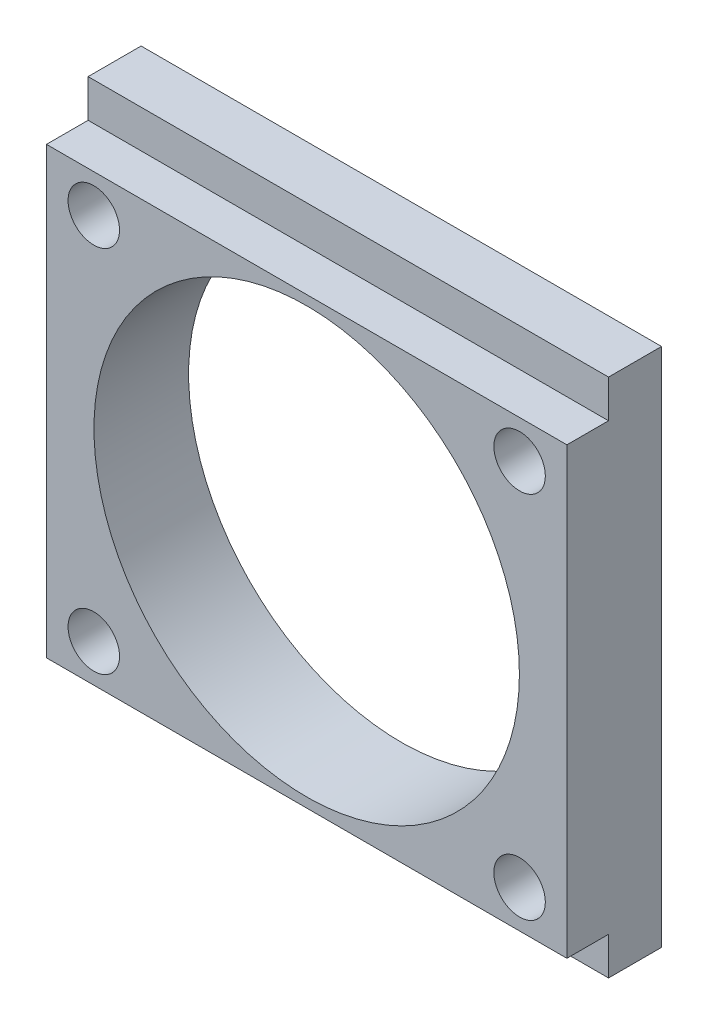
ISO-10303-21;
HEADER;
FILE_DESCRIPTION(('STEP AP214'),'2;1');
FILE_NAME('part.step','',(''),(''),'','','');
FILE_SCHEMA(('AUTOMOTIVE_DESIGN { 1 0 10303 214 1 1 1 1 }'));
ENDSEC;
DATA;
#1=APPLICATION_CONTEXT('core data for automotive mechanical design processes');
#2=APPLICATION_PROTOCOL_DEFINITION('international standard','automotive_design',2000,#1);
#3=PRODUCT_CONTEXT('',#1,'mechanical');
#4=PRODUCT('Part','Part','',(#3));
#5=PRODUCT_RELATED_PRODUCT_CATEGORY('part','',(#4));
#6=PRODUCT_DEFINITION_FORMATION('','',#4);
#7=PRODUCT_DEFINITION_CONTEXT('part definition',#1,'design');
#8=PRODUCT_DEFINITION('design','',#6,#7);
#9=PRODUCT_DEFINITION_SHAPE('','',#8);
#10=(LENGTH_UNIT() NAMED_UNIT(*) SI_UNIT(.MILLI.,.METRE.));
#11=(NAMED_UNIT(*) PLANE_ANGLE_UNIT() SI_UNIT($,.RADIAN.));
#12=(NAMED_UNIT(*) SI_UNIT($,.STERADIAN.) SOLID_ANGLE_UNIT());
#13=UNCERTAINTY_MEASURE_WITH_UNIT(LENGTH_MEASURE(1.E-05),#10,'distance_accuracy_value','');
#14=(GEOMETRIC_REPRESENTATION_CONTEXT(3) GLOBAL_UNCERTAINTY_ASSIGNED_CONTEXT((#13)) GLOBAL_UNIT_ASSIGNED_CONTEXT((#10,
#11,#12)) REPRESENTATION_CONTEXT('',''));
#15=CARTESIAN_POINT('',(0.,0.,0.));
#16=DIRECTION('',(0.,0.,1.));
#17=DIRECTION('',(1.,0.,0.));
#18=AXIS2_PLACEMENT_3D('',#15,#16,#17);
#19=CARTESIAN_POINT('',(17.4625,33.655,3.556));
#20=DIRECTION('',(0.,0.,1.));
#21=DIRECTION('',(1.,0.,0.));
#22=AXIS2_PLACEMENT_3D('',#19,#20,#21);
#23=PLANE('',#22);
#24=DIRECTION('',(0.,1.,0.));
#25=VECTOR('',#24,1.);
#26=CARTESIAN_POINT('',(0.,0.,3.556));
#27=LINE('',#26,#25);
#28=CARTESIAN_POINT('',(0.,32.385,3.556));
#29=VERTEX_POINT('',#28);
#30=CARTESIAN_POINT('',(0.,34.925,3.556));
#31=VERTEX_POINT('',#30);
#32=EDGE_CURVE('E91',#29,#31,#27,.T.);
#33=ORIENTED_EDGE('',*,*,#32,.F.);
#34=DIRECTION('',(1.,0.,0.));
#35=VECTOR('',#34,1.);
#36=CARTESIAN_POINT('',(0.,32.385,3.556));
#37=LINE('',#36,#35);
#38=CARTESIAN_POINT('',(34.925,32.385,3.556));
#39=VERTEX_POINT('',#38);
#40=EDGE_CURVE('E86',#29,#39,#37,.T.);
#41=ORIENTED_EDGE('',*,*,#40,.T.);
#42=DIRECTION('',(0.,1.,0.));
#43=VECTOR('',#42,1.);
#44=CARTESIAN_POINT('',(34.925,34.925,3.556));
#45=LINE('',#44,#43);
#46=CARTESIAN_POINT('',(34.925,34.925,3.556));
#47=VERTEX_POINT('',#46);
#48=EDGE_CURVE('E89',#47,#39,#45,.F.);
#49=ORIENTED_EDGE('',*,*,#48,.F.);
#50=DIRECTION('',(1.,0.,0.));
#51=VECTOR('',#50,1.);
#52=CARTESIAN_POINT('',(0.,34.925,3.556));
#53=LINE('',#52,#51);
#54=EDGE_CURVE('E104',#31,#47,#53,.T.);
#55=ORIENTED_EDGE('',*,*,#54,.F.);
#56=EDGE_LOOP('',(#33,#41,#49,#55));
#57=FACE_BOUND('',#56,.T.);
#58=ADVANCED_FACE('F17',(#57),#23,.T.);
#59=CARTESIAN_POINT('',(17.4625,1.27,3.556));
#60=DIRECTION('',(0.,0.,1.));
#61=DIRECTION('',(1.,0.,0.));
#62=AXIS2_PLACEMENT_3D('',#59,#60,#61);
#63=PLANE('',#62);
#64=DIRECTION('',(1.,0.,0.));
#65=VECTOR('',#64,1.);
#66=CARTESIAN_POINT('',(34.925,2.54,3.556));
#67=LINE('',#66,#65);
#68=CARTESIAN_POINT('',(34.925,2.54,3.556));
#69=VERTEX_POINT('',#68);
#70=CARTESIAN_POINT('',(0.,2.54,3.556));
#71=VERTEX_POINT('',#70);
#72=EDGE_CURVE('E80',#69,#71,#67,.F.);
#73=ORIENTED_EDGE('',*,*,#72,.T.);
#74=DIRECTION('',(0.,1.,0.));
#75=VECTOR('',#74,1.);
#76=CARTESIAN_POINT('',(0.,0.,3.556));
#77=LINE('',#76,#75);
#78=CARTESIAN_POINT('',(0.,0.,3.556));
#79=VERTEX_POINT('',#78);
#80=EDGE_CURVE('E164',#79,#71,#77,.T.);
#81=ORIENTED_EDGE('',*,*,#80,.F.);
#82=DIRECTION('',(1.,0.,0.));
#83=VECTOR('',#82,1.);
#84=CARTESIAN_POINT('',(34.925,0.,3.556));
#85=LINE('',#84,#83);
#86=CARTESIAN_POINT('',(34.925,0.,3.556));
#87=VERTEX_POINT('',#86);
#88=EDGE_CURVE('E160',#87,#79,#85,.F.);
#89=ORIENTED_EDGE('',*,*,#88,.F.);
#90=DIRECTION('',(0.,1.,0.));
#91=VECTOR('',#90,1.);
#92=CARTESIAN_POINT('',(34.925,34.925,3.556));
#93=LINE('',#92,#91);
#94=EDGE_CURVE('E105',#69,#87,#93,.F.);
#95=ORIENTED_EDGE('',*,*,#94,.F.);
#96=EDGE_LOOP('',(#73,#81,#89,#95));
#97=FACE_BOUND('',#96,.T.);
#98=ADVANCED_FACE('F178',(#97),#63,.T.);
#99=CARTESIAN_POINT('',(0.,32.385,6.35));
#100=DIRECTION('',(0.,-1.,0.));
#101=DIRECTION('',(0.,0.,-1.));
#102=AXIS2_PLACEMENT_3D('',#99,#100,#101);
#103=PLANE('',#102);
#104=DIRECTION('',(0.,0.,1.));
#105=VECTOR('',#104,1.);
#106=CARTESIAN_POINT('',(0.,32.385,0.));
#107=LINE('',#106,#105);
#108=CARTESIAN_POINT('',(0.,32.385,6.35));
#109=VERTEX_POINT('',#108);
#110=EDGE_CURVE('E169',#109,#29,#107,.F.);
#111=ORIENTED_EDGE('',*,*,#110,.F.);
#112=DIRECTION('',(1.,0.,0.));
#113=VECTOR('',#112,1.);
#114=CARTESIAN_POINT('',(17.4625,32.385,6.35));
#115=LINE('',#114,#113);
#116=CARTESIAN_POINT('',(34.925,32.385,6.35));
#117=VERTEX_POINT('',#116);
#118=EDGE_CURVE('E109',#117,#109,#115,.F.);
#119=ORIENTED_EDGE('',*,*,#118,.F.);
#120=DIRECTION('',(0.,0.,-1.));
#121=VECTOR('',#120,1.);
#122=CARTESIAN_POINT('',(34.925,32.385,0.));
#123=LINE('',#122,#121);
#124=EDGE_CURVE('E100',#39,#117,#123,.F.);
#125=ORIENTED_EDGE('',*,*,#124,.F.);
#126=ORIENTED_EDGE('',*,*,#40,.F.);
#127=EDGE_LOOP('',(#111,#119,#125,#126));
#128=FACE_BOUND('',#127,.T.);
#129=ADVANCED_FACE('F108',(#128),#103,.F.);
#130=CARTESIAN_POINT('',(34.925,2.54,6.35));
#131=DIRECTION('',(0.,1.,0.));
#132=DIRECTION('',(0.,0.,1.));
#133=AXIS2_PLACEMENT_3D('',#130,#131,#132);
#134=PLANE('',#133);
#135=DIRECTION('',(0.,0.,-1.));
#136=VECTOR('',#135,1.);
#137=CARTESIAN_POINT('',(34.925,2.54,0.));
#138=LINE('',#137,#136);
#139=CARTESIAN_POINT('',(34.925,2.54,6.35));
#140=VERTEX_POINT('',#139);
#141=EDGE_CURVE('E110',#140,#69,#138,.T.);
#142=ORIENTED_EDGE('',*,*,#141,.F.);
#143=DIRECTION('',(1.,0.,0.));
#144=VECTOR('',#143,1.);
#145=CARTESIAN_POINT('',(17.4625,2.54,6.35));
#146=LINE('',#145,#144);
#147=CARTESIAN_POINT('',(0.,2.54,6.35));
#148=VERTEX_POINT('',#147);
#149=EDGE_CURVE('E145',#148,#140,#146,.T.);
#150=ORIENTED_EDGE('',*,*,#149,.F.);
#151=DIRECTION('',(0.,0.,1.));
#152=VECTOR('',#151,1.);
#153=CARTESIAN_POINT('',(0.,2.54,0.));
#154=LINE('',#153,#152);
#155=EDGE_CURVE('E162',#71,#148,#154,.T.);
#156=ORIENTED_EDGE('',*,*,#155,.F.);
#157=ORIENTED_EDGE('',*,*,#72,.F.);
#158=EDGE_LOOP('',(#142,#150,#156,#157));
#159=FACE_BOUND('',#158,.T.);
#160=ADVANCED_FACE('F235',(#159),#134,.F.);
#161=CARTESIAN_POINT('',(34.925,34.925,0.));
#162=DIRECTION('',(1.,0.,0.));
#163=DIRECTION('',(0.,0.,-1.));
#164=AXIS2_PLACEMENT_3D('',#161,#162,#163);
#165=PLANE('',#164);
#166=DIRECTION('',(0.,0.,1.));
#167=VECTOR('',#166,1.);
#168=CARTESIAN_POINT('',(34.925,34.925,0.));
#169=LINE('',#168,#167);
#170=CARTESIAN_POINT('',(34.925,34.925,0.));
#171=VERTEX_POINT('',#170);
#172=EDGE_CURVE('E103',#47,#171,#169,.F.);
#173=ORIENTED_EDGE('',*,*,#172,.F.);
#174=ORIENTED_EDGE('',*,*,#48,.T.);
#175=ORIENTED_EDGE('',*,*,#124,.T.);
#176=DIRECTION('',(0.,1.,0.));
#177=VECTOR('',#176,1.);
#178=CARTESIAN_POINT('',(34.925,17.4625,6.35));
#179=LINE('',#178,#177);
#180=EDGE_CURVE('E142',#140,#117,#179,.T.);
#181=ORIENTED_EDGE('',*,*,#180,.F.);
#182=ORIENTED_EDGE('',*,*,#141,.T.);
#183=ORIENTED_EDGE('',*,*,#94,.T.);
#184=DIRECTION('',(0.,0.,-1.));
#185=VECTOR('',#184,1.);
#186=CARTESIAN_POINT('',(34.925,0.,0.));
#187=LINE('',#186,#185);
#188=CARTESIAN_POINT('',(34.925,0.,0.));
#189=VERTEX_POINT('',#188);
#190=EDGE_CURVE('E156',#189,#87,#187,.F.);
#191=ORIENTED_EDGE('',*,*,#190,.F.);
#192=DIRECTION('',(0.,1.,0.));
#193=VECTOR('',#192,1.);
#194=CARTESIAN_POINT('',(34.925,17.4625,0.));
#195=LINE('',#194,#193);
#196=EDGE_CURVE('E134',#189,#171,#195,.T.);
#197=ORIENTED_EDGE('',*,*,#196,.T.);
#198=EDGE_LOOP('',(#173,#174,#175,#181,#182,#183,#191,#197));
#199=FACE_BOUND('',#198,.T.);
#200=ADVANCED_FACE('F98',(#199),#165,.T.);
#201=CARTESIAN_POINT('',(0.,34.925,0.));
#202=DIRECTION('',(0.,1.,0.));
#203=DIRECTION('',(0.,0.,1.));
#204=AXIS2_PLACEMENT_3D('',#201,#202,#203);
#205=PLANE('',#204);
#206=DIRECTION('',(1.,0.,0.));
#207=VECTOR('',#206,1.);
#208=CARTESIAN_POINT('',(17.4625,34.925,0.));
#209=LINE('',#208,#207);
#210=CARTESIAN_POINT('',(0.,34.925,0.));
#211=VERTEX_POINT('',#210);
#212=EDGE_CURVE('E188',#171,#211,#209,.F.);
#213=ORIENTED_EDGE('',*,*,#212,.T.);
#214=DIRECTION('',(0.,0.,1.));
#215=VECTOR('',#214,1.);
#216=CARTESIAN_POINT('',(0.,34.925,0.));
#217=LINE('',#216,#215);
#218=EDGE_CURVE('E166',#31,#211,#217,.F.);
#219=ORIENTED_EDGE('',*,*,#218,.F.);
#220=ORIENTED_EDGE('',*,*,#54,.T.);
#221=ORIENTED_EDGE('',*,*,#172,.T.);
#222=EDGE_LOOP('',(#213,#219,#220,#221));
#223=FACE_BOUND('',#222,.T.);
#224=ADVANCED_FACE('F230',(#223),#205,.T.);
#225=CARTESIAN_POINT('',(0.,0.,0.));
#226=DIRECTION('',(-1.,0.,0.));
#227=DIRECTION('',(0.,0.,1.));
#228=AXIS2_PLACEMENT_3D('',#225,#226,#227);
#229=PLANE('',#228);
#230=ORIENTED_EDGE('',*,*,#155,.T.);
#231=DIRECTION('',(0.,1.,0.));
#232=VECTOR('',#231,1.);
#233=CARTESIAN_POINT('',(0.,17.4625,6.35));
#234=LINE('',#233,#232);
#235=EDGE_CURVE('E148',#109,#148,#234,.F.);
#236=ORIENTED_EDGE('',*,*,#235,.F.);
#237=ORIENTED_EDGE('',*,*,#110,.T.);
#238=ORIENTED_EDGE('',*,*,#32,.T.);
#239=ORIENTED_EDGE('',*,*,#218,.T.);
#240=DIRECTION('',(0.,1.,0.));
#241=VECTOR('',#240,1.);
#242=CARTESIAN_POINT('',(0.,17.4625,0.));
#243=LINE('',#242,#241);
#244=CARTESIAN_POINT('',(0.,0.,0.));
#245=VERTEX_POINT('',#244);
#246=EDGE_CURVE('E183',#211,#245,#243,.F.);
#247=ORIENTED_EDGE('',*,*,#246,.T.);
#248=DIRECTION('',(0.,0.,-1.));
#249=VECTOR('',#248,1.);
#250=CARTESIAN_POINT('',(0.,0.,0.));
#251=LINE('',#250,#249);
#252=EDGE_CURVE('E35',#79,#245,#251,.T.);
#253=ORIENTED_EDGE('',*,*,#252,.F.);
#254=ORIENTED_EDGE('',*,*,#80,.T.);
#255=EDGE_LOOP('',(#230,#236,#237,#238,#239,#247,#253,#254));
#256=FACE_BOUND('',#255,.T.);
#257=ADVANCED_FACE('F181',(#256),#229,.T.);
#258=CARTESIAN_POINT('',(34.925,0.,0.));
#259=DIRECTION('',(0.,-1.,0.));
#260=DIRECTION('',(0.,0.,-1.));
#261=AXIS2_PLACEMENT_3D('',#258,#259,#260);
#262=PLANE('',#261);
#263=DIRECTION('',(1.,0.,0.));
#264=VECTOR('',#263,1.);
#265=CARTESIAN_POINT('',(17.4625,0.,0.));
#266=LINE('',#265,#264);
#267=EDGE_CURVE('E130',#245,#189,#266,.T.);
#268=ORIENTED_EDGE('',*,*,#267,.T.);
#269=ORIENTED_EDGE('',*,*,#190,.T.);
#270=ORIENTED_EDGE('',*,*,#88,.T.);
#271=ORIENTED_EDGE('',*,*,#252,.T.);
#272=EDGE_LOOP('',(#268,#269,#270,#271));
#273=FACE_BOUND('',#272,.T.);
#274=ADVANCED_FACE('F176',(#273),#262,.T.);
#275=CARTESIAN_POINT('',(31.75,5.08,0.));
#276=DIRECTION('',(0.,0.,1.));
#277=DIRECTION('',(1.,0.,0.));
#278=AXIS2_PLACEMENT_3D('',#275,#276,#277);
#279=CYLINDRICAL_SURFACE('',#278,1.7272);
#280=CARTESIAN_POINT('',(31.75,5.08,0.));
#281=DIRECTION('',(0.,0.,1.));
#282=DIRECTION('',(1.,0.,0.));
#283=AXIS2_PLACEMENT_3D('',#280,#281,#282);
#284=CIRCLE('',#283,1.7272);
#285=CARTESIAN_POINT('',(33.4772,5.08,0.));
#286=VERTEX_POINT('',#285);
#287=EDGE_CURVE('E127',#286,#286,#284,.F.);
#288=ORIENTED_EDGE('',*,*,#287,.T.);
#289=EDGE_LOOP('',(#288));
#290=FACE_BOUND('',#289,.T.);
#291=CARTESIAN_POINT('',(31.75,5.08,6.35));
#292=DIRECTION('',(0.,0.,1.));
#293=DIRECTION('',(1.,0.,0.));
#294=AXIS2_PLACEMENT_3D('',#291,#292,#293);
#295=CIRCLE('',#294,1.7272);
#296=CARTESIAN_POINT('',(33.4772,5.08,6.35));
#297=VERTEX_POINT('',#296);
#298=EDGE_CURVE('E131',#297,#297,#295,.F.);
#299=ORIENTED_EDGE('',*,*,#298,.F.);
#300=EDGE_LOOP('',(#299));
#301=FACE_BOUND('',#300,.T.);
#302=ADVANCED_FACE('F221',(#290,#301),#279,.F.);
#303=CARTESIAN_POINT('',(3.175,5.08,0.));
#304=DIRECTION('',(0.,0.,1.));
#305=DIRECTION('',(1.,0.,0.));
#306=AXIS2_PLACEMENT_3D('',#303,#304,#305);
#307=CYLINDRICAL_SURFACE('',#306,1.7272);
#308=CARTESIAN_POINT('',(3.175,5.08,0.));
#309=DIRECTION('',(0.,0.,1.));
#310=DIRECTION('',(1.,0.,0.));
#311=AXIS2_PLACEMENT_3D('',#308,#309,#310);
#312=CIRCLE('',#311,1.7272);
#313=CARTESIAN_POINT('',(4.9022,5.08,0.));
#314=VERTEX_POINT('',#313);
#315=EDGE_CURVE('E124',#314,#314,#312,.F.);
#316=ORIENTED_EDGE('',*,*,#315,.T.);
#317=EDGE_LOOP('',(#316));
#318=FACE_BOUND('',#317,.T.);
#319=CARTESIAN_POINT('',(3.175,5.08,6.35));
#320=DIRECTION('',(0.,0.,1.));
#321=DIRECTION('',(1.,0.,0.));
#322=AXIS2_PLACEMENT_3D('',#319,#320,#321);
#323=CIRCLE('',#322,1.7272);
#324=CARTESIAN_POINT('',(4.9022,5.08,6.35));
#325=VERTEX_POINT('',#324);
#326=EDGE_CURVE('E135',#325,#325,#323,.F.);
#327=ORIENTED_EDGE('',*,*,#326,.F.);
#328=EDGE_LOOP('',(#327));
#329=FACE_BOUND('',#328,.T.);
#330=ADVANCED_FACE('F217',(#318,#329),#307,.F.);
#331=CARTESIAN_POINT('',(31.75,29.845,0.));
#332=DIRECTION('',(0.,0.,1.));
#333=DIRECTION('',(1.,0.,0.));
#334=AXIS2_PLACEMENT_3D('',#331,#332,#333);
#335=CYLINDRICAL_SURFACE('',#334,1.7272);
#336=CARTESIAN_POINT('',(31.75,29.845,0.));
#337=DIRECTION('',(0.,0.,1.));
#338=DIRECTION('',(1.,0.,0.));
#339=AXIS2_PLACEMENT_3D('',#336,#337,#338);
#340=CIRCLE('',#339,1.7272);
#341=CARTESIAN_POINT('',(33.4772,29.845,0.));
#342=VERTEX_POINT('',#341);
#343=EDGE_CURVE('E121',#342,#342,#340,.F.);
#344=ORIENTED_EDGE('',*,*,#343,.T.);
#345=EDGE_LOOP('',(#344));
#346=FACE_BOUND('',#345,.T.);
#347=CARTESIAN_POINT('',(31.75,29.845,6.35));
#348=DIRECTION('',(0.,0.,1.));
#349=DIRECTION('',(1.,0.,0.));
#350=AXIS2_PLACEMENT_3D('',#347,#348,#349);
#351=CIRCLE('',#350,1.7272);
#352=CARTESIAN_POINT('',(33.4772,29.845,6.35));
#353=VERTEX_POINT('',#352);
#354=EDGE_CURVE('E137',#353,#353,#351,.F.);
#355=ORIENTED_EDGE('',*,*,#354,.F.);
#356=EDGE_LOOP('',(#355));
#357=FACE_BOUND('',#356,.T.);
#358=ADVANCED_FACE('F213',(#346,#357),#335,.F.);
#359=CARTESIAN_POINT('',(3.175,29.845,0.));
#360=DIRECTION('',(0.,0.,1.));
#361=DIRECTION('',(1.,0.,0.));
#362=AXIS2_PLACEMENT_3D('',#359,#360,#361);
#363=CYLINDRICAL_SURFACE('',#362,1.7272);
#364=CARTESIAN_POINT('',(3.175,29.845,0.));
#365=DIRECTION('',(0.,0.,1.));
#366=DIRECTION('',(1.,0.,0.));
#367=AXIS2_PLACEMENT_3D('',#364,#365,#366);
#368=CIRCLE('',#367,1.7272);
#369=CARTESIAN_POINT('',(4.9022,29.845,0.));
#370=VERTEX_POINT('',#369);
#371=EDGE_CURVE('E118',#370,#370,#368,.F.);
#372=ORIENTED_EDGE('',*,*,#371,.T.);
#373=EDGE_LOOP('',(#372));
#374=FACE_BOUND('',#373,.T.);
#375=CARTESIAN_POINT('',(3.175,29.845,6.35));
#376=DIRECTION('',(0.,0.,1.));
#377=DIRECTION('',(1.,0.,0.));
#378=AXIS2_PLACEMENT_3D('',#375,#376,#377);
#379=CIRCLE('',#378,1.7272);
#380=CARTESIAN_POINT('',(4.9022,29.845,6.35));
#381=VERTEX_POINT('',#380);
#382=EDGE_CURVE('E20',#381,#381,#379,.F.);
#383=ORIENTED_EDGE('',*,*,#382,.F.);
#384=EDGE_LOOP('',(#383));
#385=FACE_BOUND('',#384,.T.);
#386=ADVANCED_FACE('F205',(#374,#385),#363,.F.);
#387=CARTESIAN_POINT('',(17.4625,17.4625,6.35));
#388=DIRECTION('',(0.,0.,1.));
#389=DIRECTION('',(1.,0.,0.));
#390=AXIS2_PLACEMENT_3D('',#387,#388,#389);
#391=PLANE('',#390);
#392=CARTESIAN_POINT('',(17.4625,17.4625,6.35));
#393=DIRECTION('',(0.,0.,1.));
#394=DIRECTION('',(1.,0.,0.));
#395=AXIS2_PLACEMENT_3D('',#392,#393,#394);
#396=CIRCLE('',#395,14.2748);
#397=CARTESIAN_POINT('',(31.7373,17.4625,6.35));
#398=VERTEX_POINT('',#397);
#399=EDGE_CURVE('E26',#398,#398,#396,.F.);
#400=ORIENTED_EDGE('',*,*,#399,.T.);
#401=EDGE_LOOP('',(#400));
#402=FACE_BOUND('',#401,.T.);
#403=ORIENTED_EDGE('',*,*,#298,.T.);
#404=EDGE_LOOP('',(#403));
#405=FACE_BOUND('',#404,.T.);
#406=ORIENTED_EDGE('',*,*,#326,.T.);
#407=EDGE_LOOP('',(#406));
#408=FACE_BOUND('',#407,.T.);
#409=ORIENTED_EDGE('',*,*,#354,.T.);
#410=EDGE_LOOP('',(#409));
#411=FACE_BOUND('',#410,.T.);
#412=ORIENTED_EDGE('',*,*,#382,.T.);
#413=EDGE_LOOP('',(#412));
#414=FACE_BOUND('',#413,.T.);
#415=ORIENTED_EDGE('',*,*,#149,.T.);
#416=ORIENTED_EDGE('',*,*,#180,.T.);
#417=ORIENTED_EDGE('',*,*,#118,.T.);
#418=ORIENTED_EDGE('',*,*,#235,.T.);
#419=EDGE_LOOP('',(#415,#416,#417,#418));
#420=FACE_BOUND('',#419,.T.);
#421=ADVANCED_FACE('F195',(#402,#405,#408,#411,#414,#420),#391,.T.);
#422=CARTESIAN_POINT('',(17.4625,17.4625,0.));
#423=DIRECTION('',(0.,0.,1.));
#424=DIRECTION('',(1.,0.,0.));
#425=AXIS2_PLACEMENT_3D('',#422,#423,#424);
#426=PLANE('',#425);
#427=ORIENTED_EDGE('',*,*,#371,.F.);
#428=EDGE_LOOP('',(#427));
#429=FACE_BOUND('',#428,.T.);
#430=ORIENTED_EDGE('',*,*,#343,.F.);
#431=EDGE_LOOP('',(#430));
#432=FACE_BOUND('',#431,.T.);
#433=ORIENTED_EDGE('',*,*,#315,.F.);
#434=EDGE_LOOP('',(#433));
#435=FACE_BOUND('',#434,.T.);
#436=ORIENTED_EDGE('',*,*,#287,.F.);
#437=EDGE_LOOP('',(#436));
#438=FACE_BOUND('',#437,.T.);
#439=CARTESIAN_POINT('',(17.4625,17.4625,0.));
#440=DIRECTION('',(0.,0.,1.));
#441=DIRECTION('',(1.,0.,0.));
#442=AXIS2_PLACEMENT_3D('',#439,#440,#441);
#443=CIRCLE('',#442,14.2748);
#444=CARTESIAN_POINT('',(31.7373,17.4625,0.));
#445=VERTEX_POINT('',#444);
#446=EDGE_CURVE('E11',#445,#445,#443,.T.);
#447=ORIENTED_EDGE('',*,*,#446,.T.);
#448=EDGE_LOOP('',(#447));
#449=FACE_BOUND('',#448,.T.);
#450=ORIENTED_EDGE('',*,*,#246,.F.);
#451=ORIENTED_EDGE('',*,*,#212,.F.);
#452=ORIENTED_EDGE('',*,*,#196,.F.);
#453=ORIENTED_EDGE('',*,*,#267,.F.);
#454=EDGE_LOOP('',(#450,#451,#452,#453));
#455=FACE_BOUND('',#454,.T.);
#456=ADVANCED_FACE('F192',(#429,#432,#435,#438,#449,#455),#426,.F.);
#457=CARTESIAN_POINT('',(17.4625,17.4625,0.));
#458=DIRECTION('',(0.,0.,1.));
#459=DIRECTION('',(1.,0.,0.));
#460=AXIS2_PLACEMENT_3D('',#457,#458,#459);
#461=CYLINDRICAL_SURFACE('',#460,14.2748);
#462=ORIENTED_EDGE('',*,*,#446,.F.);
#463=EDGE_LOOP('',(#462));
#464=FACE_BOUND('',#463,.T.);
#465=ORIENTED_EDGE('',*,*,#399,.F.);
#466=EDGE_LOOP('',(#465));
#467=FACE_BOUND('',#466,.T.);
#468=ADVANCED_FACE('F194',(#464,#467),#461,.F.);
#469=CLOSED_SHELL('',(#58,#98,#129,#160,#200,#224,#257,#274,#302,#330,#358,#386,#421,#456,#468));
#470=MANIFOLD_SOLID_BREP('B1',#469);
#471=ADVANCED_BREP_SHAPE_REPRESENTATION('',(#18,#470),#14);
#472=SHAPE_DEFINITION_REPRESENTATION(#9,#471);
ENDSEC;
END-ISO-10303-21;
